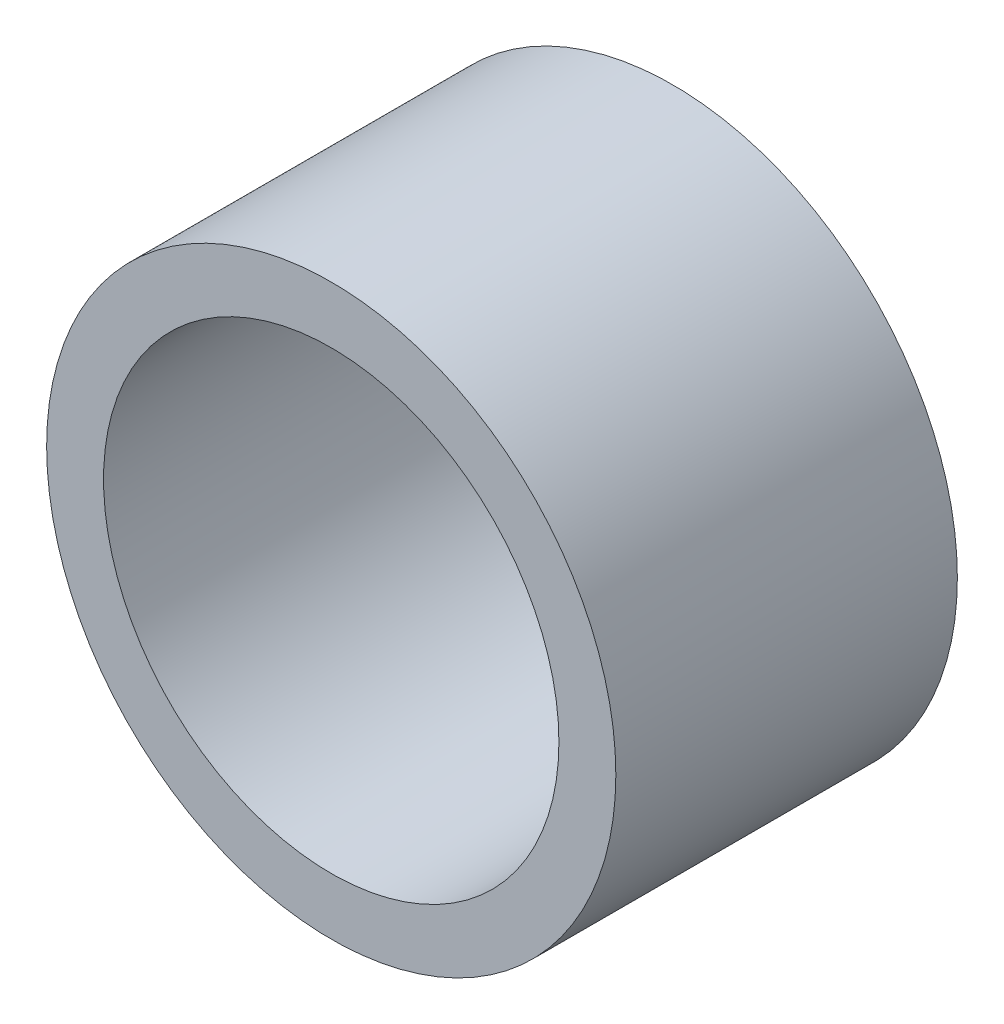
ISO-10303-21;
HEADER;
FILE_DESCRIPTION(('STEP AP214'),'2;1');
FILE_NAME('part.step','',(''),(''),'','','');
FILE_SCHEMA(('AUTOMOTIVE_DESIGN { 1 0 10303 214 1 1 1 1 }'));
ENDSEC;
DATA;
#1=APPLICATION_CONTEXT('core data for automotive mechanical design processes');
#2=APPLICATION_PROTOCOL_DEFINITION('international standard','automotive_design',2000,#1);
#3=PRODUCT_CONTEXT('',#1,'mechanical');
#4=PRODUCT('Part','Part','',(#3));
#5=PRODUCT_RELATED_PRODUCT_CATEGORY('part','',(#4));
#6=PRODUCT_DEFINITION_FORMATION('','',#4);
#7=PRODUCT_DEFINITION_CONTEXT('part definition',#1,'design');
#8=PRODUCT_DEFINITION('design','',#6,#7);
#9=PRODUCT_DEFINITION_SHAPE('','',#8);
#10=(LENGTH_UNIT() NAMED_UNIT(*) SI_UNIT(.MILLI.,.METRE.));
#11=(NAMED_UNIT(*) PLANE_ANGLE_UNIT() SI_UNIT($,.RADIAN.));
#12=(NAMED_UNIT(*) SI_UNIT($,.STERADIAN.) SOLID_ANGLE_UNIT());
#13=UNCERTAINTY_MEASURE_WITH_UNIT(LENGTH_MEASURE(1.E-05),#10,'distance_accuracy_value','');
#14=(GEOMETRIC_REPRESENTATION_CONTEXT(3) GLOBAL_UNCERTAINTY_ASSIGNED_CONTEXT((#13)) GLOBAL_UNIT_ASSIGNED_CONTEXT((#10,
#11,#12)) REPRESENTATION_CONTEXT('',''));
#15=CARTESIAN_POINT('',(0.,0.,0.));
#16=DIRECTION('',(0.,0.,1.));
#17=DIRECTION('',(1.,0.,0.));
#18=AXIS2_PLACEMENT_3D('',#15,#16,#17);
#19=CARTESIAN_POINT('',(0.,0.,6.));
#20=DIRECTION('',(0.,0.,1.));
#21=DIRECTION('',(1.,0.,0.));
#22=AXIS2_PLACEMENT_3D('',#19,#20,#21);
#23=PLANE('',#22);
#24=CARTESIAN_POINT('',(0.,0.,6.));
#25=DIRECTION('',(0.,0.,1.));
#26=DIRECTION('',(1.,0.,0.));
#27=AXIS2_PLACEMENT_3D('',#24,#25,#26);
#28=CIRCLE('',#27,5.);
#29=CARTESIAN_POINT('',(5.,0.,6.));
#30=VERTEX_POINT('',#29);
#31=EDGE_CURVE('E10',#30,#30,#28,.T.);
#32=ORIENTED_EDGE('',*,*,#31,.T.);
#33=EDGE_LOOP('',(#32));
#34=FACE_BOUND('',#33,.T.);
#35=CARTESIAN_POINT('',(0.,0.,6.));
#36=DIRECTION('',(0.,0.,1.));
#37=DIRECTION('',(1.,0.,0.));
#38=AXIS2_PLACEMENT_3D('',#35,#36,#37);
#39=CIRCLE('',#38,4.);
#40=CARTESIAN_POINT('',(4.,0.,6.));
#41=VERTEX_POINT('',#40);
#42=EDGE_CURVE('E43',#41,#41,#39,.T.);
#43=ORIENTED_EDGE('',*,*,#42,.F.);
#44=EDGE_LOOP('',(#43));
#45=FACE_BOUND('',#44,.T.);
#46=ADVANCED_FACE('F32',(#34,#45),#23,.T.);
#47=CARTESIAN_POINT('',(0.,0.,0.));
#48=DIRECTION('',(0.,0.,1.));
#49=DIRECTION('',(1.,0.,0.));
#50=AXIS2_PLACEMENT_3D('',#47,#48,#49);
#51=PLANE('',#50);
#52=CARTESIAN_POINT('',(0.,0.,0.));
#53=DIRECTION('',(0.,0.,1.));
#54=DIRECTION('',(1.,0.,0.));
#55=AXIS2_PLACEMENT_3D('',#52,#53,#54);
#56=CIRCLE('',#55,5.);
#57=CARTESIAN_POINT('',(5.,0.,0.));
#58=VERTEX_POINT('',#57);
#59=EDGE_CURVE('E36',#58,#58,#56,.T.);
#60=ORIENTED_EDGE('',*,*,#59,.F.);
#61=EDGE_LOOP('',(#60));
#62=FACE_BOUND('',#61,.T.);
#63=CARTESIAN_POINT('',(0.,0.,0.));
#64=DIRECTION('',(0.,0.,1.));
#65=DIRECTION('',(1.,0.,0.));
#66=AXIS2_PLACEMENT_3D('',#63,#64,#65);
#67=CIRCLE('',#66,4.);
#68=CARTESIAN_POINT('',(4.,0.,0.));
#69=VERTEX_POINT('',#68);
#70=EDGE_CURVE('E45',#69,#69,#67,.T.);
#71=ORIENTED_EDGE('',*,*,#70,.T.);
#72=EDGE_LOOP('',(#71));
#73=FACE_BOUND('',#72,.T.);
#74=ADVANCED_FACE('F55',(#62,#73),#51,.F.);
#75=CARTESIAN_POINT('',(0.,0.,6.));
#76=DIRECTION('',(0.,0.,-1.));
#77=DIRECTION('',(-1.,0.,0.));
#78=AXIS2_PLACEMENT_3D('',#75,#76,#77);
#79=CYLINDRICAL_SURFACE('',#78,5.);
#80=ORIENTED_EDGE('',*,*,#31,.F.);
#81=EDGE_LOOP('',(#80));
#82=FACE_BOUND('',#81,.T.);
#83=ORIENTED_EDGE('',*,*,#59,.T.);
#84=EDGE_LOOP('',(#83));
#85=FACE_BOUND('',#84,.T.);
#86=ADVANCED_FACE('F34',(#82,#85),#79,.T.);
#87=CARTESIAN_POINT('',(0.,0.,6.));
#88=DIRECTION('',(0.,0.,-1.));
#89=DIRECTION('',(-1.,0.,0.));
#90=AXIS2_PLACEMENT_3D('',#87,#88,#89);
#91=CYLINDRICAL_SURFACE('',#90,4.);
#92=ORIENTED_EDGE('',*,*,#42,.T.);
#93=EDGE_LOOP('',(#92));
#94=FACE_BOUND('',#93,.T.);
#95=ORIENTED_EDGE('',*,*,#70,.F.);
#96=EDGE_LOOP('',(#95));
#97=FACE_BOUND('',#96,.T.);
#98=ADVANCED_FACE('F51',(#94,#97),#91,.F.);
#99=CLOSED_SHELL('',(#46,#74,#86,#98));
#100=MANIFOLD_SOLID_BREP('B2',#99);
#101=ADVANCED_BREP_SHAPE_REPRESENTATION('',(#18,#100),#14);
#102=SHAPE_DEFINITION_REPRESENTATION(#9,#101);
ENDSEC;
END-ISO-10303-21;
